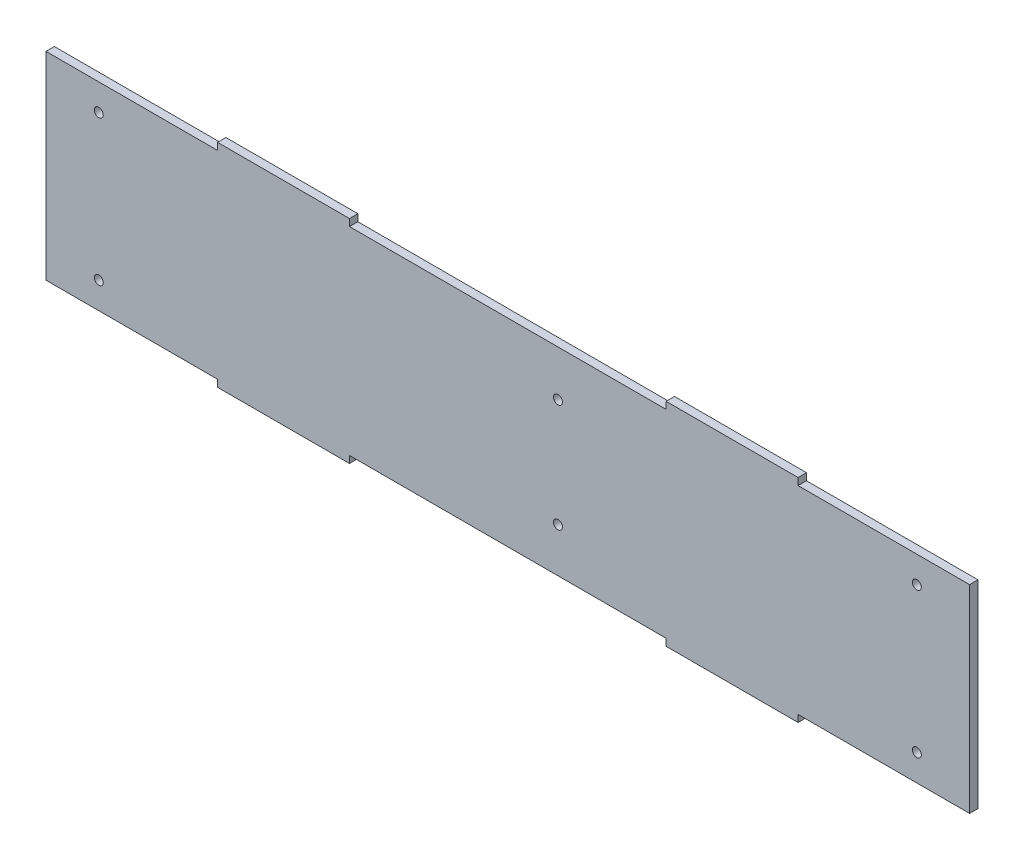
ISO-10303-21;
HEADER;
FILE_DESCRIPTION(('STEP AP214'),'2;1');
FILE_NAME('part.step','',(''),(''),'','','');
FILE_SCHEMA(('AUTOMOTIVE_DESIGN { 1 0 10303 214 1 1 1 1 }'));
ENDSEC;
DATA;
#1=APPLICATION_CONTEXT('core data for automotive mechanical design processes');
#2=APPLICATION_PROTOCOL_DEFINITION('international standard','automotive_design',2000,#1);
#3=PRODUCT_CONTEXT('',#1,'mechanical');
#4=PRODUCT('Part','Part','',(#3));
#5=PRODUCT_RELATED_PRODUCT_CATEGORY('part','',(#4));
#6=PRODUCT_DEFINITION_FORMATION('','',#4);
#7=PRODUCT_DEFINITION_CONTEXT('part definition',#1,'design');
#8=PRODUCT_DEFINITION('design','',#6,#7);
#9=PRODUCT_DEFINITION_SHAPE('','',#8);
#10=(LENGTH_UNIT() NAMED_UNIT(*) SI_UNIT(.MILLI.,.METRE.));
#11=(NAMED_UNIT(*) PLANE_ANGLE_UNIT() SI_UNIT($,.RADIAN.));
#12=(NAMED_UNIT(*) SI_UNIT($,.STERADIAN.) SOLID_ANGLE_UNIT());
#13=UNCERTAINTY_MEASURE_WITH_UNIT(LENGTH_MEASURE(1.E-05),#10,'distance_accuracy_value','');
#14=(GEOMETRIC_REPRESENTATION_CONTEXT(3) GLOBAL_UNCERTAINTY_ASSIGNED_CONTEXT((#13)) GLOBAL_UNIT_ASSIGNED_CONTEXT((#10,
#11,#12)) REPRESENTATION_CONTEXT('',''));
#15=CARTESIAN_POINT('',(0.,0.,0.));
#16=DIRECTION('',(0.,0.,1.));
#17=DIRECTION('',(1.,0.,0.));
#18=AXIS2_PLACEMENT_3D('',#15,#16,#17);
#19=CARTESIAN_POINT('',(0.,0.,3.175));
#20=DIRECTION('',(0.,0.,1.));
#21=DIRECTION('',(1.,0.,0.));
#22=AXIS2_PLACEMENT_3D('',#19,#20,#21);
#23=PLANE('',#22);
#24=CARTESIAN_POINT('',(193.999999999998,16.8,3.175));
#25=DIRECTION('',(0.,0.,1.));
#26=DIRECTION('',(1.,0.,0.));
#27=AXIS2_PLACEMENT_3D('',#24,#25,#26);
#28=CIRCLE('',#27,1.70000000000001);
#29=CARTESIAN_POINT('',(195.699999999998,16.8,3.175));
#30=VERTEX_POINT('',#29);
#31=EDGE_CURVE('E769',#30,#30,#28,.T.);
#32=ORIENTED_EDGE('',*,*,#31,.F.);
#33=EDGE_LOOP('',(#32));
#34=FACE_BOUND('',#33,.T.);
#35=CARTESIAN_POINT('',(330.,65.05,3.175));
#36=DIRECTION('',(0.,0.,1.));
#37=DIRECTION('',(1.,0.,0.));
#38=AXIS2_PLACEMENT_3D('',#35,#36,#37);
#39=CIRCLE('',#38,1.69999999999996);
#40=CARTESIAN_POINT('',(331.7,65.05,3.175));
#41=VERTEX_POINT('',#40);
#42=EDGE_CURVE('E784',#41,#41,#39,.T.);
#43=ORIENTED_EDGE('',*,*,#42,.F.);
#44=EDGE_LOOP('',(#43));
#45=FACE_BOUND('',#44,.T.);
#46=CARTESIAN_POINT('',(19.9999999999978,10.05,3.175));
#47=DIRECTION('',(0.,0.,1.));
#48=DIRECTION('',(1.,0.,0.));
#49=AXIS2_PLACEMENT_3D('',#46,#47,#48);
#50=CIRCLE('',#49,1.7);
#51=CARTESIAN_POINT('',(21.6999999999978,10.05,3.175));
#52=VERTEX_POINT('',#51);
#53=EDGE_CURVE('E218',#52,#52,#50,.T.);
#54=ORIENTED_EDGE('',*,*,#53,.F.);
#55=EDGE_LOOP('',(#54));
#56=FACE_BOUND('',#55,.T.);
#57=DIRECTION('',(0.,-1.,0.));
#58=VECTOR('',#57,1.);
#59=CARTESIAN_POINT('',(0.,75.1,3.175));
#60=LINE('',#59,#58);
#61=CARTESIAN_POINT('',(0.,75.1,3.175));
#62=VERTEX_POINT('',#61);
#63=CARTESIAN_POINT('',(0.,0.,3.175));
#64=VERTEX_POINT('',#63);
#65=EDGE_CURVE('E230',#62,#64,#60,.T.);
#66=ORIENTED_EDGE('',*,*,#65,.T.);
#67=DIRECTION('',(1.,0.,0.));
#68=VECTOR('',#67,1.);
#69=CARTESIAN_POINT('',(0.,0.,3.175));
#70=LINE('',#69,#68);
#71=CARTESIAN_POINT('',(65.,0.,3.175));
#72=VERTEX_POINT('',#71);
#73=EDGE_CURVE('E139',#64,#72,#70,.T.);
#74=ORIENTED_EDGE('',*,*,#73,.T.);
#75=DIRECTION('',(0.,-1.,0.));
#76=VECTOR('',#75,1.);
#77=CARTESIAN_POINT('',(65.,0.,3.175));
#78=LINE('',#77,#76);
#79=CARTESIAN_POINT('',(65.,-2.65000000000003,3.175));
#80=VERTEX_POINT('',#79);
#81=EDGE_CURVE('E284',#72,#80,#78,.T.);
#82=ORIENTED_EDGE('',*,*,#81,.T.);
#83=DIRECTION('',(1.,0.,0.));
#84=VECTOR('',#83,1.);
#85=CARTESIAN_POINT('',(65.,-2.65000000000003,3.175));
#86=LINE('',#85,#84);
#87=CARTESIAN_POINT('',(115.,-2.65000000000003,3.175));
#88=VERTEX_POINT('',#87);
#89=EDGE_CURVE('E319',#80,#88,#86,.T.);
#90=ORIENTED_EDGE('',*,*,#89,.T.);
#91=DIRECTION('',(0.,1.,0.));
#92=VECTOR('',#91,1.);
#93=CARTESIAN_POINT('',(115.,-2.65000000000003,3.175));
#94=LINE('',#93,#92);
#95=CARTESIAN_POINT('',(115.,0.,3.175));
#96=VERTEX_POINT('',#95);
#97=EDGE_CURVE('E321',#88,#96,#94,.T.);
#98=ORIENTED_EDGE('',*,*,#97,.T.);
#99=DIRECTION('',(1.,0.,0.));
#100=VECTOR('',#99,1.);
#101=CARTESIAN_POINT('',(115.,0.,3.175));
#102=LINE('',#101,#100);
#103=CARTESIAN_POINT('',(235.,0.,3.175));
#104=VERTEX_POINT('',#103);
#105=EDGE_CURVE('E323',#96,#104,#102,.T.);
#106=ORIENTED_EDGE('',*,*,#105,.T.);
#107=DIRECTION('',(0.,-1.,0.));
#108=VECTOR('',#107,1.);
#109=CARTESIAN_POINT('',(235.,0.,3.175));
#110=LINE('',#109,#108);
#111=CARTESIAN_POINT('',(235.,-2.65000000000003,3.175));
#112=VERTEX_POINT('',#111);
#113=EDGE_CURVE('E325',#104,#112,#110,.T.);
#114=ORIENTED_EDGE('',*,*,#113,.T.);
#115=DIRECTION('',(1.,0.,0.));
#116=VECTOR('',#115,1.);
#117=CARTESIAN_POINT('',(235.,-2.65000000000003,3.175));
#118=LINE('',#117,#116);
#119=CARTESIAN_POINT('',(285.,-2.65000000000003,3.175));
#120=VERTEX_POINT('',#119);
#121=EDGE_CURVE('E327',#112,#120,#118,.T.);
#122=ORIENTED_EDGE('',*,*,#121,.T.);
#123=DIRECTION('',(0.,1.,0.));
#124=VECTOR('',#123,1.);
#125=CARTESIAN_POINT('',(285.,-2.65000000000003,3.175));
#126=LINE('',#125,#124);
#127=CARTESIAN_POINT('',(285.,0.,3.175));
#128=VERTEX_POINT('',#127);
#129=EDGE_CURVE('E329',#120,#128,#126,.T.);
#130=ORIENTED_EDGE('',*,*,#129,.T.);
#131=DIRECTION('',(1.,0.,0.));
#132=VECTOR('',#131,1.);
#133=CARTESIAN_POINT('',(285.,0.,3.175));
#134=LINE('',#133,#132);
#135=CARTESIAN_POINT('',(350.,0.,3.175));
#136=VERTEX_POINT('',#135);
#137=EDGE_CURVE('E331',#128,#136,#134,.T.);
#138=ORIENTED_EDGE('',*,*,#137,.T.);
#139=DIRECTION('',(0.,1.,0.));
#140=VECTOR('',#139,1.);
#141=CARTESIAN_POINT('',(350.,0.,3.175));
#142=LINE('',#141,#140);
#143=CARTESIAN_POINT('',(350.,75.1,3.175));
#144=VERTEX_POINT('',#143);
#145=EDGE_CURVE('E333',#136,#144,#142,.T.);
#146=ORIENTED_EDGE('',*,*,#145,.T.);
#147=DIRECTION('',(-1.,0.,0.));
#148=VECTOR('',#147,1.);
#149=CARTESIAN_POINT('',(350.,75.1,3.175));
#150=LINE('',#149,#148);
#151=CARTESIAN_POINT('',(285.,75.1,3.175));
#152=VERTEX_POINT('',#151);
#153=EDGE_CURVE('E335',#144,#152,#150,.T.);
#154=ORIENTED_EDGE('',*,*,#153,.T.);
#155=DIRECTION('',(0.,1.,0.));
#156=VECTOR('',#155,1.);
#157=CARTESIAN_POINT('',(285.,75.1,3.175));
#158=LINE('',#157,#156);
#159=CARTESIAN_POINT('',(285.,77.75,3.175));
#160=VERTEX_POINT('',#159);
#161=EDGE_CURVE('E337',#152,#160,#158,.T.);
#162=ORIENTED_EDGE('',*,*,#161,.T.);
#163=DIRECTION('',(-1.,0.,0.));
#164=VECTOR('',#163,1.);
#165=CARTESIAN_POINT('',(285.,77.75,3.175));
#166=LINE('',#165,#164);
#167=CARTESIAN_POINT('',(235.,77.75,3.175));
#168=VERTEX_POINT('',#167);
#169=EDGE_CURVE('E339',#160,#168,#166,.T.);
#170=ORIENTED_EDGE('',*,*,#169,.T.);
#171=DIRECTION('',(0.,-1.,0.));
#172=VECTOR('',#171,1.);
#173=CARTESIAN_POINT('',(235.,77.75,3.175));
#174=LINE('',#173,#172);
#175=CARTESIAN_POINT('',(235.,75.1,3.175));
#176=VERTEX_POINT('',#175);
#177=EDGE_CURVE('E341',#168,#176,#174,.T.);
#178=ORIENTED_EDGE('',*,*,#177,.T.);
#179=DIRECTION('',(-1.,0.,0.));
#180=VECTOR('',#179,1.);
#181=CARTESIAN_POINT('',(235.,75.1,3.175));
#182=LINE('',#181,#180);
#183=CARTESIAN_POINT('',(115.,75.1,3.175));
#184=VERTEX_POINT('',#183);
#185=EDGE_CURVE('E343',#176,#184,#182,.T.);
#186=ORIENTED_EDGE('',*,*,#185,.T.);
#187=DIRECTION('',(0.,1.,0.));
#188=VECTOR('',#187,1.);
#189=CARTESIAN_POINT('',(115.,75.1,3.175));
#190=LINE('',#189,#188);
#191=CARTESIAN_POINT('',(115.,77.75,3.175));
#192=VERTEX_POINT('',#191);
#193=EDGE_CURVE('E194',#184,#192,#190,.T.);
#194=ORIENTED_EDGE('',*,*,#193,.T.);
#195=DIRECTION('',(-1.,0.,0.));
#196=VECTOR('',#195,1.);
#197=CARTESIAN_POINT('',(115.,77.75,3.175));
#198=LINE('',#197,#196);
#199=CARTESIAN_POINT('',(65.,77.75,3.175));
#200=VERTEX_POINT('',#199);
#201=EDGE_CURVE('E188',#192,#200,#198,.T.);
#202=ORIENTED_EDGE('',*,*,#201,.T.);
#203=DIRECTION('',(0.,-1.,0.));
#204=VECTOR('',#203,1.);
#205=CARTESIAN_POINT('',(65.,77.75,3.175));
#206=LINE('',#205,#204);
#207=CARTESIAN_POINT('',(65.,75.1,3.175));
#208=VERTEX_POINT('',#207);
#209=EDGE_CURVE('E192',#200,#208,#206,.T.);
#210=ORIENTED_EDGE('',*,*,#209,.T.);
#211=DIRECTION('',(-1.,0.,0.));
#212=VECTOR('',#211,1.);
#213=CARTESIAN_POINT('',(65.,75.1,3.175));
#214=LINE('',#213,#212);
#215=EDGE_CURVE('E60',#208,#62,#214,.T.);
#216=ORIENTED_EDGE('',*,*,#215,.T.);
#217=EDGE_LOOP('',(#66,#74,#82,#90,#98,#106,#114,#122,#130,#138,#146,#154,#162,#170,#178,#186,
#194,#202,#210,#216));
#218=FACE_BOUND('',#217,.T.);
#219=CARTESIAN_POINT('',(330.,10.05,3.175));
#220=DIRECTION('',(0.,0.,1.));
#221=DIRECTION('',(1.,0.,0.));
#222=AXIS2_PLACEMENT_3D('',#219,#220,#221);
#223=CIRCLE('',#222,1.69999999999996);
#224=CARTESIAN_POINT('',(331.7,10.05,3.175));
#225=VERTEX_POINT('',#224);
#226=EDGE_CURVE('E315',#225,#225,#223,.T.);
#227=ORIENTED_EDGE('',*,*,#226,.F.);
#228=EDGE_LOOP('',(#227));
#229=FACE_BOUND('',#228,.T.);
#230=CARTESIAN_POINT('',(19.9999999999978,65.05,3.175));
#231=DIRECTION('',(0.,0.,1.));
#232=DIRECTION('',(1.,0.,0.));
#233=AXIS2_PLACEMENT_3D('',#230,#231,#232);
#234=CIRCLE('',#233,1.7);
#235=CARTESIAN_POINT('',(21.6999999999978,65.05,3.175));
#236=VERTEX_POINT('',#235);
#237=EDGE_CURVE('E776',#236,#236,#234,.T.);
#238=ORIENTED_EDGE('',*,*,#237,.F.);
#239=EDGE_LOOP('',(#238));
#240=FACE_BOUND('',#239,.T.);
#241=CARTESIAN_POINT('',(193.999999999998,57.8,3.175));
#242=DIRECTION('',(0.,0.,1.));
#243=DIRECTION('',(1.,0.,0.));
#244=AXIS2_PLACEMENT_3D('',#241,#242,#243);
#245=CIRCLE('',#244,1.70000000000001);
#246=CARTESIAN_POINT('',(195.699999999998,57.8,3.175));
#247=VERTEX_POINT('',#246);
#248=EDGE_CURVE('E758',#247,#247,#245,.T.);
#249=ORIENTED_EDGE('',*,*,#248,.F.);
#250=EDGE_LOOP('',(#249));
#251=FACE_BOUND('',#250,.T.);
#252=ADVANCED_FACE('F43',(#34,#45,#56,#218,#229,#240,#251),#23,.T.);
#253=CARTESIAN_POINT('',(0.,0.,0.));
#254=DIRECTION('',(0.,0.,1.));
#255=DIRECTION('',(1.,0.,0.));
#256=AXIS2_PLACEMENT_3D('',#253,#254,#255);
#257=PLANE('',#256);
#258=DIRECTION('',(0.,-1.,0.));
#259=VECTOR('',#258,1.);
#260=CARTESIAN_POINT('',(0.,75.1,0.));
#261=LINE('',#260,#259);
#262=CARTESIAN_POINT('',(0.,75.1,0.));
#263=VERTEX_POINT('',#262);
#264=CARTESIAN_POINT('',(0.,0.,0.));
#265=VERTEX_POINT('',#264);
#266=EDGE_CURVE('E212',#263,#265,#261,.T.);
#267=ORIENTED_EDGE('',*,*,#266,.F.);
#268=DIRECTION('',(-1.,0.,0.));
#269=VECTOR('',#268,1.);
#270=CARTESIAN_POINT('',(65.,75.1,0.));
#271=LINE('',#270,#269);
#272=CARTESIAN_POINT('',(65.,75.1,0.));
#273=VERTEX_POINT('',#272);
#274=EDGE_CURVE('E131',#273,#263,#271,.T.);
#275=ORIENTED_EDGE('',*,*,#274,.F.);
#276=DIRECTION('',(0.,-1.,0.));
#277=VECTOR('',#276,1.);
#278=CARTESIAN_POINT('',(65.,77.75,0.));
#279=LINE('',#278,#277);
#280=CARTESIAN_POINT('',(65.,77.75,0.));
#281=VERTEX_POINT('',#280);
#282=EDGE_CURVE('E125',#281,#273,#279,.T.);
#283=ORIENTED_EDGE('',*,*,#282,.F.);
#284=DIRECTION('',(-1.,0.,0.));
#285=VECTOR('',#284,1.);
#286=CARTESIAN_POINT('',(115.,77.75,0.));
#287=LINE('',#286,#285);
#288=CARTESIAN_POINT('',(115.,77.75,0.));
#289=VERTEX_POINT('',#288);
#290=EDGE_CURVE('E202',#289,#281,#287,.T.);
#291=ORIENTED_EDGE('',*,*,#290,.F.);
#292=DIRECTION('',(0.,1.,0.));
#293=VECTOR('',#292,1.);
#294=CARTESIAN_POINT('',(115.,75.1,0.));
#295=LINE('',#294,#293);
#296=CARTESIAN_POINT('',(115.,75.1,0.));
#297=VERTEX_POINT('',#296);
#298=EDGE_CURVE('E355',#297,#289,#295,.T.);
#299=ORIENTED_EDGE('',*,*,#298,.F.);
#300=DIRECTION('',(-1.,0.,0.));
#301=VECTOR('',#300,1.);
#302=CARTESIAN_POINT('',(235.,75.1,0.));
#303=LINE('',#302,#301);
#304=CARTESIAN_POINT('',(235.,75.1,0.));
#305=VERTEX_POINT('',#304);
#306=EDGE_CURVE('E351',#305,#297,#303,.T.);
#307=ORIENTED_EDGE('',*,*,#306,.F.);
#308=DIRECTION('',(0.,-1.,0.));
#309=VECTOR('',#308,1.);
#310=CARTESIAN_POINT('',(235.,77.75,0.));
#311=LINE('',#310,#309);
#312=CARTESIAN_POINT('',(235.,77.75,0.));
#313=VERTEX_POINT('',#312);
#314=EDGE_CURVE('E370',#313,#305,#311,.T.);
#315=ORIENTED_EDGE('',*,*,#314,.F.);
#316=DIRECTION('',(-1.,0.,0.));
#317=VECTOR('',#316,1.);
#318=CARTESIAN_POINT('',(285.,77.75,0.));
#319=LINE('',#318,#317);
#320=CARTESIAN_POINT('',(285.,77.75,0.));
#321=VERTEX_POINT('',#320);
#322=EDGE_CURVE('E374',#321,#313,#319,.T.);
#323=ORIENTED_EDGE('',*,*,#322,.F.);
#324=DIRECTION('',(0.,1.,0.));
#325=VECTOR('',#324,1.);
#326=CARTESIAN_POINT('',(285.,75.1,0.));
#327=LINE('',#326,#325);
#328=CARTESIAN_POINT('',(285.,75.1,0.));
#329=VERTEX_POINT('',#328);
#330=EDGE_CURVE('E378',#329,#321,#327,.T.);
#331=ORIENTED_EDGE('',*,*,#330,.F.);
#332=DIRECTION('',(-1.,0.,0.));
#333=VECTOR('',#332,1.);
#334=CARTESIAN_POINT('',(350.,75.1,0.));
#335=LINE('',#334,#333);
#336=CARTESIAN_POINT('',(350.,75.1,0.));
#337=VERTEX_POINT('',#336);
#338=EDGE_CURVE('E386',#337,#329,#335,.T.);
#339=ORIENTED_EDGE('',*,*,#338,.F.);
#340=DIRECTION('',(0.,1.,0.));
#341=VECTOR('',#340,1.);
#342=CARTESIAN_POINT('',(350.,0.,0.));
#343=LINE('',#342,#341);
#344=CARTESIAN_POINT('',(350.,0.,0.));
#345=VERTEX_POINT('',#344);
#346=EDGE_CURVE('E389',#345,#337,#343,.T.);
#347=ORIENTED_EDGE('',*,*,#346,.F.);
#348=DIRECTION('',(1.,0.,0.));
#349=VECTOR('',#348,1.);
#350=CARTESIAN_POINT('',(285.,0.,0.));
#351=LINE('',#350,#349);
#352=CARTESIAN_POINT('',(285.,0.,0.));
#353=VERTEX_POINT('',#352);
#354=EDGE_CURVE('E393',#353,#345,#351,.T.);
#355=ORIENTED_EDGE('',*,*,#354,.F.);
#356=DIRECTION('',(0.,1.,0.));
#357=VECTOR('',#356,1.);
#358=CARTESIAN_POINT('',(285.,-2.65000000000003,0.));
#359=LINE('',#358,#357);
#360=CARTESIAN_POINT('',(285.,-2.65000000000003,0.));
#361=VERTEX_POINT('',#360);
#362=EDGE_CURVE('E397',#361,#353,#359,.T.);
#363=ORIENTED_EDGE('',*,*,#362,.F.);
#364=DIRECTION('',(1.,0.,0.));
#365=VECTOR('',#364,1.);
#366=CARTESIAN_POINT('',(235.,-2.65000000000003,0.));
#367=LINE('',#366,#365);
#368=CARTESIAN_POINT('',(235.,-2.65000000000003,0.));
#369=VERTEX_POINT('',#368);
#370=EDGE_CURVE('E405',#369,#361,#367,.T.);
#371=ORIENTED_EDGE('',*,*,#370,.F.);
#372=DIRECTION('',(0.,-1.,0.));
#373=VECTOR('',#372,1.);
#374=CARTESIAN_POINT('',(235.,0.,0.));
#375=LINE('',#374,#373);
#376=CARTESIAN_POINT('',(235.,0.,0.));
#377=VERTEX_POINT('',#376);
#378=EDGE_CURVE('E408',#377,#369,#375,.T.);
#379=ORIENTED_EDGE('',*,*,#378,.F.);
#380=DIRECTION('',(1.,0.,0.));
#381=VECTOR('',#380,1.);
#382=CARTESIAN_POINT('',(115.,0.,0.));
#383=LINE('',#382,#381);
#384=CARTESIAN_POINT('',(115.,0.,0.));
#385=VERTEX_POINT('',#384);
#386=EDGE_CURVE('E412',#385,#377,#383,.T.);
#387=ORIENTED_EDGE('',*,*,#386,.F.);
#388=DIRECTION('',(0.,1.,0.));
#389=VECTOR('',#388,1.);
#390=CARTESIAN_POINT('',(115.,-2.65000000000003,0.));
#391=LINE('',#390,#389);
#392=CARTESIAN_POINT('',(115.,-2.65000000000003,0.));
#393=VERTEX_POINT('',#392);
#394=EDGE_CURVE('E295',#393,#385,#391,.T.);
#395=ORIENTED_EDGE('',*,*,#394,.F.);
#396=DIRECTION('',(1.,0.,0.));
#397=VECTOR('',#396,1.);
#398=CARTESIAN_POINT('',(65.,-2.65000000000003,0.));
#399=LINE('',#398,#397);
#400=CARTESIAN_POINT('',(65.,-2.65000000000003,0.));
#401=VERTEX_POINT('',#400);
#402=EDGE_CURVE('E291',#401,#393,#399,.T.);
#403=ORIENTED_EDGE('',*,*,#402,.F.);
#404=DIRECTION('',(0.,-1.,0.));
#405=VECTOR('',#404,1.);
#406=CARTESIAN_POINT('',(65.,0.,0.));
#407=LINE('',#406,#405);
#408=CARTESIAN_POINT('',(65.,0.,0.));
#409=VERTEX_POINT('',#408);
#410=EDGE_CURVE('E283',#409,#401,#407,.T.);
#411=ORIENTED_EDGE('',*,*,#410,.F.);
#412=DIRECTION('',(1.,0.,0.));
#413=VECTOR('',#412,1.);
#414=CARTESIAN_POINT('',(0.,0.,0.));
#415=LINE('',#414,#413);
#416=EDGE_CURVE('E217',#265,#409,#415,.T.);
#417=ORIENTED_EDGE('',*,*,#416,.F.);
#418=EDGE_LOOP('',(#267,#275,#283,#291,#299,#307,#315,#323,#331,#339,#347,#355,#363,#371,#379,
#387,#395,#403,#411,#417));
#419=FACE_BOUND('',#418,.T.);
#420=CARTESIAN_POINT('',(19.9999999999978,10.05,0.));
#421=DIRECTION('',(0.,0.,1.));
#422=DIRECTION('',(1.,0.,0.));
#423=AXIS2_PLACEMENT_3D('',#420,#421,#422);
#424=CIRCLE('',#423,1.7);
#425=CARTESIAN_POINT('',(21.6999999999978,10.05,0.));
#426=VERTEX_POINT('',#425);
#427=EDGE_CURVE('E309',#426,#426,#424,.T.);
#428=ORIENTED_EDGE('',*,*,#427,.T.);
#429=EDGE_LOOP('',(#428));
#430=FACE_BOUND('',#429,.T.);
#431=CARTESIAN_POINT('',(330.,10.05,0.));
#432=DIRECTION('',(0.,0.,1.));
#433=DIRECTION('',(1.,0.,0.));
#434=AXIS2_PLACEMENT_3D('',#431,#432,#433);
#435=CIRCLE('',#434,1.69999999999996);
#436=CARTESIAN_POINT('',(331.7,10.05,0.));
#437=VERTEX_POINT('',#436);
#438=EDGE_CURVE('E786',#437,#437,#435,.T.);
#439=ORIENTED_EDGE('',*,*,#438,.T.);
#440=EDGE_LOOP('',(#439));
#441=FACE_BOUND('',#440,.T.);
#442=CARTESIAN_POINT('',(330.,65.05,0.));
#443=DIRECTION('',(0.,0.,1.));
#444=DIRECTION('',(1.,0.,0.));
#445=AXIS2_PLACEMENT_3D('',#442,#443,#444);
#446=CIRCLE('',#445,1.69999999999996);
#447=CARTESIAN_POINT('',(331.7,65.05,0.));
#448=VERTEX_POINT('',#447);
#449=EDGE_CURVE('E787',#448,#448,#446,.T.);
#450=ORIENTED_EDGE('',*,*,#449,.T.);
#451=EDGE_LOOP('',(#450));
#452=FACE_BOUND('',#451,.T.);
#453=CARTESIAN_POINT('',(19.9999999999978,65.05,0.));
#454=DIRECTION('',(0.,0.,1.));
#455=DIRECTION('',(1.,0.,0.));
#456=AXIS2_PLACEMENT_3D('',#453,#454,#455);
#457=CIRCLE('',#456,1.7);
#458=CARTESIAN_POINT('',(21.6999999999978,65.05,0.));
#459=VERTEX_POINT('',#458);
#460=EDGE_CURVE('E772',#459,#459,#457,.T.);
#461=ORIENTED_EDGE('',*,*,#460,.T.);
#462=EDGE_LOOP('',(#461));
#463=FACE_BOUND('',#462,.T.);
#464=CARTESIAN_POINT('',(193.999999999998,16.8,0.));
#465=DIRECTION('',(0.,0.,1.));
#466=DIRECTION('',(1.,0.,0.));
#467=AXIS2_PLACEMENT_3D('',#464,#465,#466);
#468=CIRCLE('',#467,1.70000000000001);
#469=CARTESIAN_POINT('',(195.699999999998,16.8,0.));
#470=VERTEX_POINT('',#469);
#471=EDGE_CURVE('E765',#470,#470,#468,.T.);
#472=ORIENTED_EDGE('',*,*,#471,.T.);
#473=EDGE_LOOP('',(#472));
#474=FACE_BOUND('',#473,.T.);
#475=CARTESIAN_POINT('',(193.999999999998,57.8,0.));
#476=DIRECTION('',(0.,0.,1.));
#477=DIRECTION('',(1.,0.,0.));
#478=AXIS2_PLACEMENT_3D('',#475,#476,#477);
#479=CIRCLE('',#478,1.70000000000001);
#480=CARTESIAN_POINT('',(195.699999999998,57.8,0.));
#481=VERTEX_POINT('',#480);
#482=EDGE_CURVE('E761',#481,#481,#479,.T.);
#483=ORIENTED_EDGE('',*,*,#482,.T.);
#484=EDGE_LOOP('',(#483));
#485=FACE_BOUND('',#484,.T.);
#486=ADVANCED_FACE('F288',(#419,#430,#441,#452,#463,#474,#485),#257,.F.);
#487=CARTESIAN_POINT('',(0.,75.1,3.175));
#488=DIRECTION('',(1.,0.,0.));
#489=DIRECTION('',(0.,1.,0.));
#490=AXIS2_PLACEMENT_3D('',#487,#488,#489);
#491=PLANE('',#490);
#492=ORIENTED_EDGE('',*,*,#266,.T.);
#493=DIRECTION('',(0.,0.,-1.));
#494=VECTOR('',#493,1.);
#495=CARTESIAN_POINT('',(0.,0.,3.175));
#496=LINE('',#495,#494);
#497=EDGE_CURVE('E12',#64,#265,#496,.T.);
#498=ORIENTED_EDGE('',*,*,#497,.F.);
#499=ORIENTED_EDGE('',*,*,#65,.F.);
#500=DIRECTION('',(0.,0.,-1.));
#501=VECTOR('',#500,1.);
#502=CARTESIAN_POINT('',(0.,75.1,3.175));
#503=LINE('',#502,#501);
#504=EDGE_CURVE('E208',#62,#263,#503,.T.);
#505=ORIENTED_EDGE('',*,*,#504,.T.);
#506=EDGE_LOOP('',(#492,#498,#499,#505));
#507=FACE_BOUND('',#506,.T.);
#508=ADVANCED_FACE('F45',(#507),#491,.F.);
#509=CARTESIAN_POINT('',(0.,0.,3.175));
#510=DIRECTION('',(0.,1.,0.));
#511=DIRECTION('',(0.,0.,1.));
#512=AXIS2_PLACEMENT_3D('',#509,#510,#511);
#513=PLANE('',#512);
#514=ORIENTED_EDGE('',*,*,#416,.T.);
#515=DIRECTION('',(0.,0.,-1.));
#516=VECTOR('',#515,1.);
#517=CARTESIAN_POINT('',(65.,0.,3.175));
#518=LINE('',#517,#516);
#519=EDGE_CURVE('E52',#72,#409,#518,.T.);
#520=ORIENTED_EDGE('',*,*,#519,.F.);
#521=ORIENTED_EDGE('',*,*,#73,.F.);
#522=ORIENTED_EDGE('',*,*,#497,.T.);
#523=EDGE_LOOP('',(#514,#520,#521,#522));
#524=FACE_BOUND('',#523,.T.);
#525=ADVANCED_FACE('F450',(#524),#513,.F.);
#526=CARTESIAN_POINT('',(65.,0.,3.175));
#527=DIRECTION('',(1.,0.,0.));
#528=DIRECTION('',(0.,0.,-1.));
#529=AXIS2_PLACEMENT_3D('',#526,#527,#528);
#530=PLANE('',#529);
#531=ORIENTED_EDGE('',*,*,#410,.T.);
#532=DIRECTION('',(0.,0.,-1.));
#533=VECTOR('',#532,1.);
#534=CARTESIAN_POINT('',(65.,-2.65000000000003,3.175));
#535=LINE('',#534,#533);
#536=EDGE_CURVE('E275',#80,#401,#535,.T.);
#537=ORIENTED_EDGE('',*,*,#536,.F.);
#538=ORIENTED_EDGE('',*,*,#81,.F.);
#539=ORIENTED_EDGE('',*,*,#519,.T.);
#540=EDGE_LOOP('',(#531,#537,#538,#539));
#541=FACE_BOUND('',#540,.T.);
#542=ADVANCED_FACE('F281',(#541),#530,.F.);
#543=CARTESIAN_POINT('',(65.,-2.65000000000003,3.175));
#544=DIRECTION('',(0.,1.,0.));
#545=DIRECTION('',(0.,0.,1.));
#546=AXIS2_PLACEMENT_3D('',#543,#544,#545);
#547=PLANE('',#546);
#548=ORIENTED_EDGE('',*,*,#402,.T.);
#549=DIRECTION('',(0.,0.,-1.));
#550=VECTOR('',#549,1.);
#551=CARTESIAN_POINT('',(115.,-2.65000000000003,3.175));
#552=LINE('',#551,#550);
#553=EDGE_CURVE('E272',#88,#393,#552,.T.);
#554=ORIENTED_EDGE('',*,*,#553,.F.);
#555=ORIENTED_EDGE('',*,*,#89,.F.);
#556=ORIENTED_EDGE('',*,*,#536,.T.);
#557=EDGE_LOOP('',(#548,#554,#555,#556));
#558=FACE_BOUND('',#557,.T.);
#559=ADVANCED_FACE('F442',(#558),#547,.F.);
#560=CARTESIAN_POINT('',(115.,-2.65000000000003,3.175));
#561=DIRECTION('',(-1.,0.,0.));
#562=DIRECTION('',(0.,0.,1.));
#563=AXIS2_PLACEMENT_3D('',#560,#561,#562);
#564=PLANE('',#563);
#565=ORIENTED_EDGE('',*,*,#394,.T.);
#566=DIRECTION('',(0.,0.,-1.));
#567=VECTOR('',#566,1.);
#568=CARTESIAN_POINT('',(115.,0.,3.175));
#569=LINE('',#568,#567);
#570=EDGE_CURVE('E269',#96,#385,#569,.T.);
#571=ORIENTED_EDGE('',*,*,#570,.F.);
#572=ORIENTED_EDGE('',*,*,#97,.F.);
#573=ORIENTED_EDGE('',*,*,#553,.T.);
#574=EDGE_LOOP('',(#565,#571,#572,#573));
#575=FACE_BOUND('',#574,.T.);
#576=ADVANCED_FACE('F419',(#575),#564,.F.);
#577=CARTESIAN_POINT('',(115.,0.,3.175));
#578=DIRECTION('',(0.,1.,0.));
#579=DIRECTION('',(0.,0.,1.));
#580=AXIS2_PLACEMENT_3D('',#577,#578,#579);
#581=PLANE('',#580);
#582=ORIENTED_EDGE('',*,*,#386,.T.);
#583=DIRECTION('',(0.,0.,-1.));
#584=VECTOR('',#583,1.);
#585=CARTESIAN_POINT('',(235.,0.,3.175));
#586=LINE('',#585,#584);
#587=EDGE_CURVE('E266',#104,#377,#586,.T.);
#588=ORIENTED_EDGE('',*,*,#587,.F.);
#589=ORIENTED_EDGE('',*,*,#105,.F.);
#590=ORIENTED_EDGE('',*,*,#570,.T.);
#591=EDGE_LOOP('',(#582,#588,#589,#590));
#592=FACE_BOUND('',#591,.T.);
#593=ADVANCED_FACE('F425',(#592),#581,.F.);
#594=CARTESIAN_POINT('',(235.,0.,3.175));
#595=DIRECTION('',(1.,0.,0.));
#596=DIRECTION('',(0.,1.,0.));
#597=AXIS2_PLACEMENT_3D('',#594,#595,#596);
#598=PLANE('',#597);
#599=ORIENTED_EDGE('',*,*,#378,.T.);
#600=DIRECTION('',(0.,0.,-1.));
#601=VECTOR('',#600,1.);
#602=CARTESIAN_POINT('',(235.,-2.65000000000003,3.175));
#603=LINE('',#602,#601);
#604=EDGE_CURVE('E263',#112,#369,#603,.T.);
#605=ORIENTED_EDGE('',*,*,#604,.F.);
#606=ORIENTED_EDGE('',*,*,#113,.F.);
#607=ORIENTED_EDGE('',*,*,#587,.T.);
#608=EDGE_LOOP('',(#599,#605,#606,#607));
#609=FACE_BOUND('',#608,.T.);
#610=ADVANCED_FACE('F432',(#609),#598,.F.);
#611=CARTESIAN_POINT('',(235.,-2.65000000000003,3.175));
#612=DIRECTION('',(0.,1.,0.));
#613=DIRECTION('',(0.,0.,1.));
#614=AXIS2_PLACEMENT_3D('',#611,#612,#613);
#615=PLANE('',#614);
#616=ORIENTED_EDGE('',*,*,#370,.T.);
#617=DIRECTION('',(0.,0.,-1.));
#618=VECTOR('',#617,1.);
#619=CARTESIAN_POINT('',(285.,-2.65000000000003,3.175));
#620=LINE('',#619,#618);
#621=EDGE_CURVE('E260',#120,#361,#620,.T.);
#622=ORIENTED_EDGE('',*,*,#621,.F.);
#623=ORIENTED_EDGE('',*,*,#121,.F.);
#624=ORIENTED_EDGE('',*,*,#604,.T.);
#625=EDGE_LOOP('',(#616,#622,#623,#624));
#626=FACE_BOUND('',#625,.T.);
#627=ADVANCED_FACE('F436',(#626),#615,.F.);
#628=CARTESIAN_POINT('',(285.,-2.65000000000003,3.175));
#629=DIRECTION('',(-1.,0.,0.));
#630=DIRECTION('',(0.,0.,1.));
#631=AXIS2_PLACEMENT_3D('',#628,#629,#630);
#632=PLANE('',#631);
#633=ORIENTED_EDGE('',*,*,#362,.T.);
#634=DIRECTION('',(0.,0.,-1.));
#635=VECTOR('',#634,1.);
#636=CARTESIAN_POINT('',(285.,0.,3.175));
#637=LINE('',#636,#635);
#638=EDGE_CURVE('E257',#128,#353,#637,.T.);
#639=ORIENTED_EDGE('',*,*,#638,.F.);
#640=ORIENTED_EDGE('',*,*,#129,.F.);
#641=ORIENTED_EDGE('',*,*,#621,.T.);
#642=EDGE_LOOP('',(#633,#639,#640,#641));
#643=FACE_BOUND('',#642,.T.);
#644=ADVANCED_FACE('F499',(#643),#632,.F.);
#645=CARTESIAN_POINT('',(285.,0.,3.175));
#646=DIRECTION('',(0.,1.,0.));
#647=DIRECTION('',(0.,0.,1.));
#648=AXIS2_PLACEMENT_3D('',#645,#646,#647);
#649=PLANE('',#648);
#650=ORIENTED_EDGE('',*,*,#354,.T.);
#651=DIRECTION('',(0.,0.,-1.));
#652=VECTOR('',#651,1.);
#653=CARTESIAN_POINT('',(350.,0.,3.175));
#654=LINE('',#653,#652);
#655=EDGE_CURVE('E254',#136,#345,#654,.T.);
#656=ORIENTED_EDGE('',*,*,#655,.F.);
#657=ORIENTED_EDGE('',*,*,#137,.F.);
#658=ORIENTED_EDGE('',*,*,#638,.T.);
#659=EDGE_LOOP('',(#650,#656,#657,#658));
#660=FACE_BOUND('',#659,.T.);
#661=ADVANCED_FACE('F495',(#660),#649,.F.);
#662=CARTESIAN_POINT('',(350.,0.,3.175));
#663=DIRECTION('',(-1.,0.,0.));
#664=DIRECTION('',(0.,0.,1.));
#665=AXIS2_PLACEMENT_3D('',#662,#663,#664);
#666=PLANE('',#665);
#667=ORIENTED_EDGE('',*,*,#346,.T.);
#668=DIRECTION('',(0.,0.,-1.));
#669=VECTOR('',#668,1.);
#670=CARTESIAN_POINT('',(350.,75.1,3.175));
#671=LINE('',#670,#669);
#672=EDGE_CURVE('E251',#144,#337,#671,.T.);
#673=ORIENTED_EDGE('',*,*,#672,.F.);
#674=ORIENTED_EDGE('',*,*,#145,.F.);
#675=ORIENTED_EDGE('',*,*,#655,.T.);
#676=EDGE_LOOP('',(#667,#673,#674,#675));
#677=FACE_BOUND('',#676,.T.);
#678=ADVANCED_FACE('F491',(#677),#666,.F.);
#679=CARTESIAN_POINT('',(350.,75.1,3.175));
#680=DIRECTION('',(0.,-1.,0.));
#681=DIRECTION('',(0.,0.,-1.));
#682=AXIS2_PLACEMENT_3D('',#679,#680,#681);
#683=PLANE('',#682);
#684=ORIENTED_EDGE('',*,*,#338,.T.);
#685=DIRECTION('',(0.,0.,-1.));
#686=VECTOR('',#685,1.);
#687=CARTESIAN_POINT('',(285.,75.1,3.175));
#688=LINE('',#687,#686);
#689=EDGE_CURVE('E248',#152,#329,#688,.T.);
#690=ORIENTED_EDGE('',*,*,#689,.F.);
#691=ORIENTED_EDGE('',*,*,#153,.F.);
#692=ORIENTED_EDGE('',*,*,#672,.T.);
#693=EDGE_LOOP('',(#684,#690,#691,#692));
#694=FACE_BOUND('',#693,.T.);
#695=ADVANCED_FACE('F487',(#694),#683,.F.);
#696=CARTESIAN_POINT('',(285.,75.1,3.175));
#697=DIRECTION('',(-1.,0.,0.));
#698=DIRECTION('',(0.,0.,1.));
#699=AXIS2_PLACEMENT_3D('',#696,#697,#698);
#700=PLANE('',#699);
#701=ORIENTED_EDGE('',*,*,#330,.T.);
#702=DIRECTION('',(0.,0.,-1.));
#703=VECTOR('',#702,1.);
#704=CARTESIAN_POINT('',(285.,77.75,3.175));
#705=LINE('',#704,#703);
#706=EDGE_CURVE('E245',#160,#321,#705,.T.);
#707=ORIENTED_EDGE('',*,*,#706,.F.);
#708=ORIENTED_EDGE('',*,*,#161,.F.);
#709=ORIENTED_EDGE('',*,*,#689,.T.);
#710=EDGE_LOOP('',(#701,#707,#708,#709));
#711=FACE_BOUND('',#710,.T.);
#712=ADVANCED_FACE('F483',(#711),#700,.F.);
#713=CARTESIAN_POINT('',(285.,77.75,3.175));
#714=DIRECTION('',(0.,-1.,0.));
#715=DIRECTION('',(0.,0.,-1.));
#716=AXIS2_PLACEMENT_3D('',#713,#714,#715);
#717=PLANE('',#716);
#718=ORIENTED_EDGE('',*,*,#322,.T.);
#719=DIRECTION('',(0.,0.,-1.));
#720=VECTOR('',#719,1.);
#721=CARTESIAN_POINT('',(235.,77.75,3.175));
#722=LINE('',#721,#720);
#723=EDGE_CURVE('E242',#168,#313,#722,.T.);
#724=ORIENTED_EDGE('',*,*,#723,.F.);
#725=ORIENTED_EDGE('',*,*,#169,.F.);
#726=ORIENTED_EDGE('',*,*,#706,.T.);
#727=EDGE_LOOP('',(#718,#724,#725,#726));
#728=FACE_BOUND('',#727,.T.);
#729=ADVANCED_FACE('F479',(#728),#717,.F.);
#730=CARTESIAN_POINT('',(235.,77.75,3.175));
#731=DIRECTION('',(1.,0.,0.));
#732=DIRECTION('',(0.,0.,-1.));
#733=AXIS2_PLACEMENT_3D('',#730,#731,#732);
#734=PLANE('',#733);
#735=ORIENTED_EDGE('',*,*,#314,.T.);
#736=DIRECTION('',(0.,0.,-1.));
#737=VECTOR('',#736,1.);
#738=CARTESIAN_POINT('',(235.,75.1,3.175));
#739=LINE('',#738,#737);
#740=EDGE_CURVE('E239',#176,#305,#739,.T.);
#741=ORIENTED_EDGE('',*,*,#740,.F.);
#742=ORIENTED_EDGE('',*,*,#177,.F.);
#743=ORIENTED_EDGE('',*,*,#723,.T.);
#744=EDGE_LOOP('',(#735,#741,#742,#743));
#745=FACE_BOUND('',#744,.T.);
#746=ADVANCED_FACE('F476',(#745),#734,.F.);
#747=CARTESIAN_POINT('',(235.,75.1,3.175));
#748=DIRECTION('',(0.,-1.,0.));
#749=DIRECTION('',(0.,0.,-1.));
#750=AXIS2_PLACEMENT_3D('',#747,#748,#749);
#751=PLANE('',#750);
#752=ORIENTED_EDGE('',*,*,#306,.T.);
#753=DIRECTION('',(0.,0.,-1.));
#754=VECTOR('',#753,1.);
#755=CARTESIAN_POINT('',(115.,75.1,3.175));
#756=LINE('',#755,#754);
#757=EDGE_CURVE('E236',#184,#297,#756,.T.);
#758=ORIENTED_EDGE('',*,*,#757,.F.);
#759=ORIENTED_EDGE('',*,*,#185,.F.);
#760=ORIENTED_EDGE('',*,*,#740,.T.);
#761=EDGE_LOOP('',(#752,#758,#759,#760));
#762=FACE_BOUND('',#761,.T.);
#763=ADVANCED_FACE('F349',(#762),#751,.F.);
#764=CARTESIAN_POINT('',(115.,75.1,3.175));
#765=DIRECTION('',(-1.,0.,0.));
#766=DIRECTION('',(0.,0.,1.));
#767=AXIS2_PLACEMENT_3D('',#764,#765,#766);
#768=PLANE('',#767);
#769=ORIENTED_EDGE('',*,*,#298,.T.);
#770=DIRECTION('',(0.,0.,-1.));
#771=VECTOR('',#770,1.);
#772=CARTESIAN_POINT('',(115.,77.75,3.175));
#773=LINE('',#772,#771);
#774=EDGE_CURVE('E203',#192,#289,#773,.T.);
#775=ORIENTED_EDGE('',*,*,#774,.F.);
#776=ORIENTED_EDGE('',*,*,#193,.F.);
#777=ORIENTED_EDGE('',*,*,#757,.T.);
#778=EDGE_LOOP('',(#769,#775,#776,#777));
#779=FACE_BOUND('',#778,.T.);
#780=ADVANCED_FACE('F354',(#779),#768,.F.);
#781=CARTESIAN_POINT('',(115.,77.75,3.175));
#782=DIRECTION('',(0.,-1.,0.));
#783=DIRECTION('',(0.,0.,-1.));
#784=AXIS2_PLACEMENT_3D('',#781,#782,#783);
#785=PLANE('',#784);
#786=ORIENTED_EDGE('',*,*,#290,.T.);
#787=DIRECTION('',(0.,0.,-1.));
#788=VECTOR('',#787,1.);
#789=CARTESIAN_POINT('',(65.,77.75,3.175));
#790=LINE('',#789,#788);
#791=EDGE_CURVE('E199',#200,#281,#790,.T.);
#792=ORIENTED_EDGE('',*,*,#791,.F.);
#793=ORIENTED_EDGE('',*,*,#201,.F.);
#794=ORIENTED_EDGE('',*,*,#774,.T.);
#795=EDGE_LOOP('',(#786,#792,#793,#794));
#796=FACE_BOUND('',#795,.T.);
#797=ADVANCED_FACE('F200',(#796),#785,.F.);
#798=CARTESIAN_POINT('',(65.,77.75,3.175));
#799=DIRECTION('',(1.,0.,0.));
#800=DIRECTION('',(0.,0.,-1.));
#801=AXIS2_PLACEMENT_3D('',#798,#799,#800);
#802=PLANE('',#801);
#803=ORIENTED_EDGE('',*,*,#282,.T.);
#804=DIRECTION('',(0.,0.,-1.));
#805=VECTOR('',#804,1.);
#806=CARTESIAN_POINT('',(65.,75.1,3.175));
#807=LINE('',#806,#805);
#808=EDGE_CURVE('E204',#208,#273,#807,.T.);
#809=ORIENTED_EDGE('',*,*,#808,.F.);
#810=ORIENTED_EDGE('',*,*,#209,.F.);
#811=ORIENTED_EDGE('',*,*,#791,.T.);
#812=EDGE_LOOP('',(#803,#809,#810,#811));
#813=FACE_BOUND('',#812,.T.);
#814=ADVANCED_FACE('F206',(#813),#802,.F.);
#815=CARTESIAN_POINT('',(65.,75.1,3.175));
#816=DIRECTION('',(0.,-1.,0.));
#817=DIRECTION('',(0.,0.,-1.));
#818=AXIS2_PLACEMENT_3D('',#815,#816,#817);
#819=PLANE('',#818);
#820=ORIENTED_EDGE('',*,*,#274,.T.);
#821=ORIENTED_EDGE('',*,*,#504,.F.);
#822=ORIENTED_EDGE('',*,*,#215,.F.);
#823=ORIENTED_EDGE('',*,*,#808,.T.);
#824=EDGE_LOOP('',(#820,#821,#822,#823));
#825=FACE_BOUND('',#824,.T.);
#826=ADVANCED_FACE('F465',(#825),#819,.F.);
#827=CARTESIAN_POINT('',(19.9999999999978,10.05,3.175));
#828=DIRECTION('',(0.,0.,-1.));
#829=DIRECTION('',(-1.,0.,0.));
#830=AXIS2_PLACEMENT_3D('',#827,#828,#829);
#831=CYLINDRICAL_SURFACE('',#830,1.7);
#832=ORIENTED_EDGE('',*,*,#53,.T.);
#833=EDGE_LOOP('',(#832));
#834=FACE_BOUND('',#833,.T.);
#835=ORIENTED_EDGE('',*,*,#427,.F.);
#836=EDGE_LOOP('',(#835));
#837=FACE_BOUND('',#836,.T.);
#838=ADVANCED_FACE('F462',(#834,#837),#831,.F.);
#839=CARTESIAN_POINT('',(330.,10.05,3.175));
#840=DIRECTION('',(0.,0.,-1.));
#841=DIRECTION('',(-1.,0.,0.));
#842=AXIS2_PLACEMENT_3D('',#839,#840,#841);
#843=CYLINDRICAL_SURFACE('',#842,1.69999999999996);
#844=ORIENTED_EDGE('',*,*,#226,.T.);
#845=EDGE_LOOP('',(#844));
#846=FACE_BOUND('',#845,.T.);
#847=ORIENTED_EDGE('',*,*,#438,.F.);
#848=EDGE_LOOP('',(#847));
#849=FACE_BOUND('',#848,.T.);
#850=ADVANCED_FACE('F575',(#846,#849),#843,.F.);
#851=CARTESIAN_POINT('',(330.,65.05,3.175));
#852=DIRECTION('',(0.,0.,-1.));
#853=DIRECTION('',(-1.,0.,0.));
#854=AXIS2_PLACEMENT_3D('',#851,#852,#853);
#855=CYLINDRICAL_SURFACE('',#854,1.69999999999996);
#856=ORIENTED_EDGE('',*,*,#42,.T.);
#857=EDGE_LOOP('',(#856));
#858=FACE_BOUND('',#857,.T.);
#859=ORIENTED_EDGE('',*,*,#449,.F.);
#860=EDGE_LOOP('',(#859));
#861=FACE_BOUND('',#860,.T.);
#862=ADVANCED_FACE('F582',(#858,#861),#855,.F.);
#863=CARTESIAN_POINT('',(19.9999999999978,65.05,3.175));
#864=DIRECTION('',(0.,0.,-1.));
#865=DIRECTION('',(-1.,0.,0.));
#866=AXIS2_PLACEMENT_3D('',#863,#864,#865);
#867=CYLINDRICAL_SURFACE('',#866,1.7);
#868=ORIENTED_EDGE('',*,*,#237,.T.);
#869=EDGE_LOOP('',(#868));
#870=FACE_BOUND('',#869,.T.);
#871=ORIENTED_EDGE('',*,*,#460,.F.);
#872=EDGE_LOOP('',(#871));
#873=FACE_BOUND('',#872,.T.);
#874=ADVANCED_FACE('F589',(#870,#873),#867,.F.);
#875=CARTESIAN_POINT('',(193.999999999998,16.8,3.175));
#876=DIRECTION('',(0.,0.,-1.));
#877=DIRECTION('',(-1.,0.,0.));
#878=AXIS2_PLACEMENT_3D('',#875,#876,#877);
#879=CYLINDRICAL_SURFACE('',#878,1.70000000000001);
#880=ORIENTED_EDGE('',*,*,#31,.T.);
#881=EDGE_LOOP('',(#880));
#882=FACE_BOUND('',#881,.T.);
#883=ORIENTED_EDGE('',*,*,#471,.F.);
#884=EDGE_LOOP('',(#883));
#885=FACE_BOUND('',#884,.T.);
#886=ADVANCED_FACE('F597',(#882,#885),#879,.F.);
#887=CARTESIAN_POINT('',(193.999999999998,57.8,3.175));
#888=DIRECTION('',(0.,0.,-1.));
#889=DIRECTION('',(-1.,0.,0.));
#890=AXIS2_PLACEMENT_3D('',#887,#888,#889);
#891=CYLINDRICAL_SURFACE('',#890,1.70000000000001);
#892=ORIENTED_EDGE('',*,*,#248,.T.);
#893=EDGE_LOOP('',(#892));
#894=FACE_BOUND('',#893,.T.);
#895=ORIENTED_EDGE('',*,*,#482,.F.);
#896=EDGE_LOOP('',(#895));
#897=FACE_BOUND('',#896,.T.);
#898=ADVANCED_FACE('F605',(#894,#897),#891,.F.);
#899=CLOSED_SHELL('',(#252,#486,#508,#525,#542,#559,#576,#593,#610,#627,#644,#661,#678,#695,
#712,#729,#746,#763,#780,#797,#814,#826,#838,#850,#862,#874,#886,#898));
#900=MANIFOLD_SOLID_BREP('B2',#899);
#901=ADVANCED_BREP_SHAPE_REPRESENTATION('',(#18,#900),#14);
#902=SHAPE_DEFINITION_REPRESENTATION(#9,#901);
ENDSEC;
END-ISO-10303-21;
